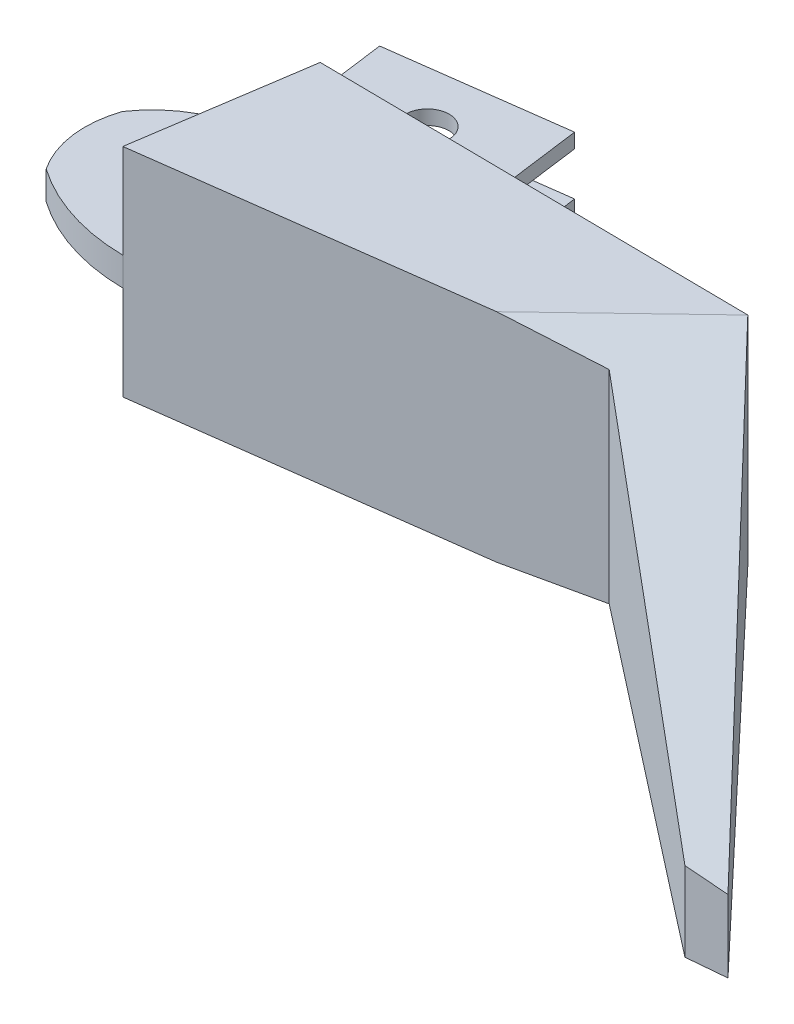
ISO-10303-21;
HEADER;
FILE_DESCRIPTION(('STEP AP214'),'2;1');
FILE_NAME('part.step','',(''),(''),'','','');
FILE_SCHEMA(('AUTOMOTIVE_DESIGN { 1 0 10303 214 1 1 1 1 }'));
ENDSEC;
DATA;
#1=APPLICATION_CONTEXT('core data for automotive mechanical design processes');
#2=APPLICATION_PROTOCOL_DEFINITION('international standard','automotive_design',2000,#1);
#3=PRODUCT_CONTEXT('',#1,'mechanical');
#4=PRODUCT('Part','Part','',(#3));
#5=PRODUCT_RELATED_PRODUCT_CATEGORY('part','',(#4));
#6=PRODUCT_DEFINITION_FORMATION('','',#4);
#7=PRODUCT_DEFINITION_CONTEXT('part definition',#1,'design');
#8=PRODUCT_DEFINITION('design','',#6,#7);
#9=PRODUCT_DEFINITION_SHAPE('','',#8);
#10=(LENGTH_UNIT() NAMED_UNIT(*) SI_UNIT(.MILLI.,.METRE.));
#11=(NAMED_UNIT(*) PLANE_ANGLE_UNIT() SI_UNIT($,.RADIAN.));
#12=(NAMED_UNIT(*) SI_UNIT($,.STERADIAN.) SOLID_ANGLE_UNIT());
#13=UNCERTAINTY_MEASURE_WITH_UNIT(LENGTH_MEASURE(1.E-05),#10,'distance_accuracy_value','');
#14=(GEOMETRIC_REPRESENTATION_CONTEXT(3) GLOBAL_UNCERTAINTY_ASSIGNED_CONTEXT((#13)) GLOBAL_UNIT_ASSIGNED_CONTEXT((#10,
#11,#12)) REPRESENTATION_CONTEXT('',''));
#15=CARTESIAN_POINT('',(0.,0.,0.));
#16=DIRECTION('',(0.,0.,1.));
#17=DIRECTION('',(1.,0.,0.));
#18=AXIS2_PLACEMENT_3D('',#15,#16,#17);
#19=CARTESIAN_POINT('',(-208.730671594199,65.2122922100915,-31.5270285220404));
#20=DIRECTION('',(0.,1.,0.));
#21=DIRECTION('',(0.,0.,1.));
#22=AXIS2_PLACEMENT_3D('',#19,#20,#21);
#23=PLANE('',#22);
#24=CARTESIAN_POINT('',(-255.193452215889,65.2122922100915,-58.7006078847417));
#25=DIRECTION('',(0.,1.,0.));
#26=DIRECTION('',(0.,0.,1.));
#27=AXIS2_PLACEMENT_3D('',#24,#25,#26);
#28=CIRCLE('',#27,9.99999999999998);
#29=CARTESIAN_POINT('',(-255.193452215889,65.2122922100915,-48.7006078847418));
#30=VERTEX_POINT('',#29);
#31=EDGE_CURVE('E310',#30,#30,#28,.T.);
#32=ORIENTED_EDGE('',*,*,#31,.T.);
#33=EDGE_LOOP('',(#32));
#34=FACE_BOUND('',#33,.T.);
#35=CARTESIAN_POINT('',(-211.981493351837,65.2122922100915,-138.427146033556));
#36=DIRECTION('',(0.,1.,0.));
#37=DIRECTION('',(0.,0.,-1.));
#38=AXIS2_PLACEMENT_3D('',#35,#36,#37);
#39=CIRCLE('',#38,138.975015680273);
#40=CARTESIAN_POINT('',(-291.658675420011,65.2122922100915,-24.5605502250968));
#41=VERTEX_POINT('',#40);
#42=CARTESIAN_POINT('',(-213.573939593585,65.2122922100915,0.538745818722125));
#43=VERTEX_POINT('',#42);
#44=EDGE_CURVE('E198',#41,#43,#39,.T.);
#45=ORIENTED_EDGE('',*,*,#44,.F.);
#46=CARTESIAN_POINT('',(-234.093409006673,65.2122922100915,-63.1153833177926));
#47=DIRECTION('',(0.,1.,0.));
#48=DIRECTION('',(0.,0.,-1.));
#49=AXIS2_PLACEMENT_3D('',#46,#47,#48);
#50=CIRCLE('',#49,69.2837286240006);
#51=CARTESIAN_POINT('',(-299.707915754918,65.2122922100915,-85.3633395436735));
#52=VERTEX_POINT('',#51);
#53=EDGE_CURVE('E186',#52,#41,#50,.T.);
#54=ORIENTED_EDGE('',*,*,#53,.F.);
#55=CARTESIAN_POINT('',(-235.950415718517,65.2122922100915,-42.2875097464173));
#56=DIRECTION('',(0.,-1.,0.));
#57=DIRECTION('',(0.,0.,-1.));
#58=AXIS2_PLACEMENT_3D('',#55,#56,#57);
#59=CIRCLE('',#58,76.9450838170563);
#60=CARTESIAN_POINT('',(-245.824298176033,65.2122922100915,-118.596436936026));
#61=VERTEX_POINT('',#60);
#62=EDGE_CURVE('E210',#61,#52,#59,.F.);
#63=ORIENTED_EDGE('',*,*,#62,.F.);
#64=DIRECTION('',(-0.999933359765905,0.,-0.0115445236917911));
#65=VECTOR('',#64,1.);
#66=CARTESIAN_POINT('',(-296.625222024867,65.2122922100915,-119.182948490231));
#67=LINE('',#66,#65);
#68=CARTESIAN_POINT('',(-224.317382142443,65.2122922100915,-118.348133287326));
#69=VERTEX_POINT('',#68);
#70=EDGE_CURVE('E355',#69,#61,#67,.T.);
#71=ORIENTED_EDGE('',*,*,#70,.F.);
#72=DIRECTION('',(0.131637339727023,0.,0.991297942492363));
#73=VECTOR('',#72,1.);
#74=CARTESIAN_POINT('',(-212.71784523073,65.2122922100915,-30.9975601270763));
#75=LINE('',#74,#73);
#76=CARTESIAN_POINT('',(-210.88984840221,65.2122922100915,-17.2317889655518));
#77=VERTEX_POINT('',#76);
#78=EDGE_CURVE('E275',#69,#77,#75,.T.);
#79=ORIENTED_EDGE('',*,*,#78,.T.);
#80=DIRECTION('',(0.149347695396157,0.,-0.988784741933176));
#81=VECTOR('',#80,1.);
#82=CARTESIAN_POINT('',(-208.730671594199,65.2122922100915,-31.5270285220404));
#83=LINE('',#82,#81);
#84=EDGE_CURVE('E205',#43,#77,#83,.T.);
#85=ORIENTED_EDGE('',*,*,#84,.F.);
#86=EDGE_LOOP('',(#45,#54,#63,#71,#79,#85));
#87=FACE_BOUND('',#86,.T.);
#88=ADVANCED_FACE('F39',(#34,#87),#23,.F.);
#89=CARTESIAN_POINT('',(-208.730671594199,84.9222773676956,-31.5270285220404));
#90=DIRECTION('',(0.,1.,0.));
#91=DIRECTION('',(0.,0.,1.));
#92=AXIS2_PLACEMENT_3D('',#89,#90,#91);
#93=PLANE('',#92);
#94=CARTESIAN_POINT('',(-234.093409006673,84.9222773676956,-63.1153833177926));
#95=DIRECTION('',(0.,1.,0.));
#96=DIRECTION('',(0.,0.,1.));
#97=AXIS2_PLACEMENT_3D('',#94,#95,#96);
#98=CIRCLE('',#97,69.2837286240006);
#99=CARTESIAN_POINT('',(-291.658675420011,84.9222773676956,-24.5605502250968));
#100=VERTEX_POINT('',#99);
#101=CARTESIAN_POINT('',(-299.707915754918,84.9222773676956,-85.3633395436735));
#102=VERTEX_POINT('',#101);
#103=EDGE_CURVE('E54',#100,#102,#98,.F.);
#104=ORIENTED_EDGE('',*,*,#103,.F.);
#105=CARTESIAN_POINT('',(-211.981493351837,84.9222773676956,-138.427146033556));
#106=DIRECTION('',(0.,1.,0.));
#107=DIRECTION('',(0.,0.,1.));
#108=AXIS2_PLACEMENT_3D('',#105,#106,#107);
#109=CIRCLE('',#108,138.975015680273);
#110=CARTESIAN_POINT('',(-213.573939593585,84.9222773676956,0.538745818722132));
#111=VERTEX_POINT('',#110);
#112=EDGE_CURVE('E201',#111,#100,#109,.F.);
#113=ORIENTED_EDGE('',*,*,#112,.F.);
#114=DIRECTION('',(0.149347695396157,0.,-0.988784741933176));
#115=VECTOR('',#114,1.);
#116=CARTESIAN_POINT('',(-208.730671594199,84.9222773676956,-31.5270285220404));
#117=LINE('',#116,#115);
#118=CARTESIAN_POINT('',(-210.88984840221,84.9222773676956,-17.2317889655518));
#119=VERTEX_POINT('',#118);
#120=EDGE_CURVE('E313',#111,#119,#117,.T.);
#121=ORIENTED_EDGE('',*,*,#120,.T.);
#122=DIRECTION('',(0.131637339727023,0.,0.991297942492363));
#123=VECTOR('',#122,1.);
#124=CARTESIAN_POINT('',(-212.71784523073,84.9222773676956,-30.9975601270763));
#125=LINE('',#124,#123);
#126=CARTESIAN_POINT('',(-224.317382142443,84.9222773676956,-118.348133287325));
#127=VERTEX_POINT('',#126);
#128=EDGE_CURVE('E270',#127,#119,#125,.T.);
#129=ORIENTED_EDGE('',*,*,#128,.F.);
#130=DIRECTION('',(-0.999933359765905,0.,-0.0115445236917911));
#131=VECTOR('',#130,1.);
#132=CARTESIAN_POINT('',(-296.625222024867,84.9222773676956,-119.182948490231));
#133=LINE('',#132,#131);
#134=CARTESIAN_POINT('',(-245.824298176033,84.9222773676956,-118.596436936026));
#135=VERTEX_POINT('',#134);
#136=EDGE_CURVE('E358',#127,#135,#133,.T.);
#137=ORIENTED_EDGE('',*,*,#136,.T.);
#138=CARTESIAN_POINT('',(-235.950415718517,84.9222773676956,-42.2875097464173));
#139=DIRECTION('',(0.,1.,0.));
#140=DIRECTION('',(0.,0.,1.));
#141=AXIS2_PLACEMENT_3D('',#138,#139,#140);
#142=CIRCLE('',#141,76.9450838170563);
#143=EDGE_CURVE('E47',#102,#135,#142,.F.);
#144=ORIENTED_EDGE('',*,*,#143,.F.);
#145=EDGE_LOOP('',(#104,#113,#121,#129,#137,#144));
#146=FACE_BOUND('',#145,.T.);
#147=CARTESIAN_POINT('',(-255.193452215889,84.9222773676956,-58.7006078847417));
#148=DIRECTION('',(0.,1.,0.));
#149=DIRECTION('',(0.,0.,1.));
#150=AXIS2_PLACEMENT_3D('',#147,#148,#149);
#151=CIRCLE('',#150,9.99999999999998);
#152=CARTESIAN_POINT('',(-255.193452215889,84.9222773676956,-48.7006078847418));
#153=VERTEX_POINT('',#152);
#154=EDGE_CURVE('E307',#153,#153,#151,.T.);
#155=ORIENTED_EDGE('',*,*,#154,.F.);
#156=EDGE_LOOP('',(#155));
#157=FACE_BOUND('',#156,.T.);
#158=ADVANCED_FACE('F391',(#146,#157),#93,.T.);
#159=CARTESIAN_POINT('',(-29.9580583713106,0.,-225.599831219089));
#160=DIRECTION('',(0.131637339727023,0.,0.991297942492363));
#161=DIRECTION('',(0.991297942492363,0.,-0.131637339727023));
#162=AXIS2_PLACEMENT_3D('',#159,#160,#161);
#163=PLANE('',#162);
#164=DIRECTION('',(0.,-1.,0.));
#165=VECTOR('',#164,1.);
#166=CARTESIAN_POINT('',(-234.944917826527,100.,-198.379029378386));
#167=LINE('',#166,#165);
#168=CARTESIAN_POINT('',(-234.944917826527,60.,-198.379029378386));
#169=VERTEX_POINT('',#168);
#170=CARTESIAN_POINT('',(-234.944917826527,50.,-198.379029378386));
#171=VERTEX_POINT('',#170);
#172=EDGE_CURVE('E248',#169,#171,#167,.T.);
#173=ORIENTED_EDGE('',*,*,#172,.F.);
#174=DIRECTION('',(0.991297942492363,0.,-0.131637339727023));
#175=VECTOR('',#174,1.);
#176=CARTESIAN_POINT('',(-29.9580583713106,60.,-225.599831219089));
#177=LINE('',#176,#175);
#178=CARTESIAN_POINT('',(-115.989164727444,60.,-214.175510145628));
#179=VERTEX_POINT('',#178);
#180=EDGE_CURVE('E374',#169,#179,#177,.T.);
#181=ORIENTED_EDGE('',*,*,#180,.T.);
#182=DIRECTION('',(0.,1.,0.));
#183=VECTOR('',#182,1.);
#184=CARTESIAN_POINT('',(-115.989164727444,100.,-214.175510145628));
#185=LINE('',#184,#183);
#186=CARTESIAN_POINT('',(-115.989164727444,50.,-214.175510145628));
#187=VERTEX_POINT('',#186);
#188=EDGE_CURVE('E242',#187,#179,#185,.T.);
#189=ORIENTED_EDGE('',*,*,#188,.F.);
#190=DIRECTION('',(0.991297942492363,0.,-0.131637339727023));
#191=VECTOR('',#190,1.);
#192=CARTESIAN_POINT('',(-234.944917826527,50.,-198.379029378386));
#193=LINE('',#192,#191);
#194=EDGE_CURVE('E252',#171,#187,#193,.T.);
#195=ORIENTED_EDGE('',*,*,#194,.F.);
#196=EDGE_LOOP('',(#173,#181,#189,#195));
#197=FACE_BOUND('',#196,.T.);
#198=ADVANCED_FACE('F410',(#197),#163,.F.);
#199=CARTESIAN_POINT('',(-296.625222024867,150.,-119.182948490231));
#200=DIRECTION('',(-0.0115445236917911,0.,0.999933359765904));
#201=DIRECTION('',(0.999933359765905,0.,0.0115445236917911));
#202=AXIS2_PLACEMENT_3D('',#199,#200,#201);
#203=PLANE('',#202);
#204=ORIENTED_EDGE('',*,*,#70,.T.);
#205=DIRECTION('',(0.,-1.,0.));
#206=VECTOR('',#205,1.);
#207=CARTESIAN_POINT('',(-245.824298176033,665.212292210092,-118.596436936026));
#208=LINE('',#207,#206);
#209=EDGE_CURVE('E207',#135,#61,#208,.T.);
#210=ORIENTED_EDGE('',*,*,#209,.F.);
#211=ORIENTED_EDGE('',*,*,#136,.F.);
#212=DIRECTION('',(0.,-1.,0.));
#213=VECTOR('',#212,1.);
#214=CARTESIAN_POINT('',(-224.317382142443,150.,-118.348133287326));
#215=LINE('',#214,#213);
#216=EDGE_CURVE('E273',#127,#69,#215,.T.);
#217=ORIENTED_EDGE('',*,*,#216,.T.);
#218=EDGE_LOOP('',(#204,#210,#211,#217));
#219=FACE_BOUND('',#218,.T.);
#220=ADVANCED_FACE('F388',(#219),#203,.F.);
#221=CARTESIAN_POINT('',(83.2218191581831,150.,-38.8736270407595));
#222=DIRECTION('',(-0.131637339727023,0.,-0.991297942492363));
#223=DIRECTION('',(-0.991297942492363,0.,0.131637339727023));
#224=AXIS2_PLACEMENT_3D('',#221,#222,#223);
#225=PLANE('',#224);
#226=DIRECTION('',(0.,1.,0.));
#227=VECTOR('',#226,1.);
#228=CARTESIAN_POINT('',(-213.573939593585,150.,0.538745818722132));
#229=LINE('',#228,#227);
#230=CARTESIAN_POINT('',(-213.573939593585,150.,0.538745818722125));
#231=VERTEX_POINT('',#230);
#232=EDGE_CURVE('E324',#111,#231,#229,.T.);
#233=ORIENTED_EDGE('',*,*,#232,.F.);
#234=DIRECTION('',(0.,-1.,0.));
#235=VECTOR('',#234,1.);
#236=CARTESIAN_POINT('',(-213.573939593585,665.212292210092,0.538745818722125));
#237=LINE('',#236,#235);
#238=EDGE_CURVE('E206',#111,#43,#237,.T.);
#239=ORIENTED_EDGE('',*,*,#238,.T.);
#240=DIRECTION('',(0.,1.,0.));
#241=VECTOR('',#240,1.);
#242=CARTESIAN_POINT('',(-213.573939593585,150.,0.538745818722132));
#243=LINE('',#242,#241);
#244=CARTESIAN_POINT('',(-213.573939593585,0.,0.538745818722125));
#245=VERTEX_POINT('',#244);
#246=EDGE_CURVE('E319',#245,#43,#243,.T.);
#247=ORIENTED_EDGE('',*,*,#246,.F.);
#248=DIRECTION('',(0.991297942492363,0.,-0.131637339727023));
#249=VECTOR('',#248,1.);
#250=CARTESIAN_POINT('',(83.2218191581831,0.,-38.8736270407595));
#251=LINE('',#250,#249);
#252=CARTESIAN_POINT('',(14.5560714943781,0.,-29.755302503432));
#253=VERTEX_POINT('',#252);
#254=EDGE_CURVE('E326',#245,#253,#251,.T.);
#255=ORIENTED_EDGE('',*,*,#254,.T.);
#256=DIRECTION('',(0.988866821875745,0.0699922109604098,-0.131314504142675));
#257=VECTOR('',#256,1.);
#258=CARTESIAN_POINT('',(93.2673781493679,5.5712035822128,-40.2076060646094));
#259=LINE('',#258,#257);
#260=CARTESIAN_POINT('',(83.2218191581831,4.86017670925883,-38.8736270407595));
#261=VERTEX_POINT('',#260);
#262=EDGE_CURVE('E298',#253,#261,#259,.T.);
#263=ORIENTED_EDGE('',*,*,#262,.T.);
#264=DIRECTION('',(0.,-1.,0.));
#265=VECTOR('',#264,1.);
#266=CARTESIAN_POINT('',(83.2218191581831,150.,-38.8736270407595));
#267=LINE('',#266,#265);
#268=CARTESIAN_POINT('',(83.2218191581831,145.139823290741,-38.8736270407595));
#269=VERTEX_POINT('',#268);
#270=EDGE_CURVE('E347',#269,#261,#267,.T.);
#271=ORIENTED_EDGE('',*,*,#270,.F.);
#272=DIRECTION('',(0.988866821875745,-0.0699922109604098,-0.131314504142675));
#273=VECTOR('',#272,1.);
#274=CARTESIAN_POINT('',(82.8854318680963,145.163632857056,-38.8289571931921));
#275=LINE('',#274,#273);
#276=CARTESIAN_POINT('',(14.5560714943781,150.,-29.755302503432));
#277=VERTEX_POINT('',#276);
#278=EDGE_CURVE('E305',#277,#269,#275,.T.);
#279=ORIENTED_EDGE('',*,*,#278,.F.);
#280=DIRECTION('',(0.991297942492363,0.,-0.131637339727023));
#281=VECTOR('',#280,1.);
#282=CARTESIAN_POINT('',(83.2218191581831,150.,-38.8736270407595));
#283=LINE('',#282,#281);
#284=EDGE_CURVE('E327',#231,#277,#283,.T.);
#285=ORIENTED_EDGE('',*,*,#284,.F.);
#286=EDGE_LOOP('',(#233,#239,#247,#255,#263,#271,#279,#285));
#287=FACE_BOUND('',#286,.T.);
#288=ADVANCED_FACE('F41',(#287),#225,.F.);
#289=CARTESIAN_POINT('',(0.,150.,0.));
#290=DIRECTION('',(0.,1.,0.));
#291=DIRECTION('',(0.,0.,1.));
#292=AXIS2_PLACEMENT_3D('',#289,#290,#291);
#293=PLANE('',#292);
#294=ORIENTED_EDGE('',*,*,#284,.T.);
#295=DIRECTION('',(0.723241509717924,0.,-0.690595191570965));
#296=VECTOR('',#295,1.);
#297=CARTESIAN_POINT('',(-268.116954932111,150.,240.158177591317));
#298=LINE('',#297,#296);
#299=CARTESIAN_POINT('',(103.374777975133,150.,-114.564831261101));
#300=VERTEX_POINT('',#299);
#301=EDGE_CURVE('E286',#277,#300,#298,.T.);
#302=ORIENTED_EDGE('',*,*,#301,.T.);
#303=DIRECTION('',(-0.999933359765904,0.,-0.0115445236917911));
#304=VECTOR('',#303,1.);
#305=CARTESIAN_POINT('',(-296.625222024867,150.,-119.182948490231));
#306=LINE('',#305,#304);
#307=CARTESIAN_POINT('',(-195.667028297471,150.,-118.017356555545));
#308=VERTEX_POINT('',#307);
#309=EDGE_CURVE('E330',#300,#308,#306,.T.);
#310=ORIENTED_EDGE('',*,*,#309,.T.);
#311=DIRECTION('',(-0.149347695396157,0.,0.988784741933176));
#312=VECTOR('',#311,1.);
#313=CARTESIAN_POINT('',(-208.730671594199,150.,-31.5270285220404));
#314=LINE('',#313,#312);
#315=EDGE_CURVE('E352',#308,#231,#314,.T.);
#316=ORIENTED_EDGE('',*,*,#315,.T.);
#317=EDGE_LOOP('',(#294,#302,#310,#316));
#318=FACE_BOUND('',#317,.T.);
#319=ADVANCED_FACE('F467',(#318),#293,.T.);
#320=CARTESIAN_POINT('',(363.661240814357,150.,189.196602820427));
#321=DIRECTION('',(0.63094783235923,0.,-0.77582525921833));
#322=DIRECTION('',(-0.77582525921833,0.,-0.63094783235923));
#323=AXIS2_PLACEMENT_3D('',#320,#321,#322);
#324=PLANE('',#323);
#325=DIRECTION('',(0.770470016775908,-0.117292938821412,0.626592626633899));
#326=VECTOR('',#325,1.);
#327=CARTESIAN_POINT('',(359.363840497909,103.101186471935,185.701698030688));
#328=LINE('',#327,#326);
#329=CARTESIAN_POINT('',(363.661240814357,102.44696930393,189.196602820427));
#330=VERTEX_POINT('',#329);
#331=EDGE_CURVE('E303',#269,#330,#328,.T.);
#332=ORIENTED_EDGE('',*,*,#331,.F.);
#333=ORIENTED_EDGE('',*,*,#270,.T.);
#334=DIRECTION('',(0.770470016775908,0.117292938821412,0.626592626633899));
#335=VECTOR('',#334,1.);
#336=CARTESIAN_POINT('',(372.919444379124,48.9624585526692,196.725931623946));
#337=LINE('',#336,#335);
#338=CARTESIAN_POINT('',(363.661240814357,47.5530306960701,189.196602820427));
#339=VERTEX_POINT('',#338);
#340=EDGE_CURVE('E295',#261,#339,#337,.T.);
#341=ORIENTED_EDGE('',*,*,#340,.T.);
#342=DIRECTION('',(0.,-1.,0.));
#343=VECTOR('',#342,1.);
#344=CARTESIAN_POINT('',(363.661240814357,150.,189.196602820427));
#345=LINE('',#344,#343);
#346=EDGE_CURVE('E344',#330,#339,#345,.T.);
#347=ORIENTED_EDGE('',*,*,#346,.F.);
#348=EDGE_LOOP('',(#332,#333,#341,#347));
#349=FACE_BOUND('',#348,.T.);
#350=ADVANCED_FACE('F470',(#349),#324,.F.);
#351=CARTESIAN_POINT('',(393.424758434938,150.,189.196602820427));
#352=DIRECTION('',(0.,0.,-1.));
#353=DIRECTION('',(-1.,0.,0.));
#354=AXIS2_PLACEMENT_3D('',#351,#352,#353);
#355=PLANE('',#354);
#356=DIRECTION('',(0.996637488754219,-0.0819372687467888,0.));
#357=VECTOR('',#356,1.);
#358=CARTESIAN_POINT('',(389.34167074698,100.335685800484,189.196602820427));
#359=LINE('',#358,#357);
#360=CARTESIAN_POINT('',(393.424758434938,100.,189.196602820427));
#361=VERTEX_POINT('',#360);
#362=EDGE_CURVE('E301',#330,#361,#359,.T.);
#363=ORIENTED_EDGE('',*,*,#362,.F.);
#364=ORIENTED_EDGE('',*,*,#346,.T.);
#365=DIRECTION('',(0.996637488754219,0.0819372687467888,0.));
#366=VECTOR('',#365,1.);
#367=CARTESIAN_POINT('',(401.590933810856,50.6713716009683,189.196602820427));
#368=LINE('',#367,#366);
#369=CARTESIAN_POINT('',(393.424758434938,50.,189.196602820427));
#370=VERTEX_POINT('',#369);
#371=EDGE_CURVE('E290',#339,#370,#368,.T.);
#372=ORIENTED_EDGE('',*,*,#371,.T.);
#373=DIRECTION('',(0.,-1.,0.));
#374=VECTOR('',#373,1.);
#375=CARTESIAN_POINT('',(393.424758434938,150.,189.196602820427));
#376=LINE('',#375,#374);
#377=EDGE_CURVE('E341',#361,#370,#376,.T.);
#378=ORIENTED_EDGE('',*,*,#377,.F.);
#379=EDGE_LOOP('',(#363,#364,#372,#378));
#380=FACE_BOUND('',#379,.T.);
#381=ADVANCED_FACE('F479',(#380),#355,.F.);
#382=CARTESIAN_POINT('',(103.374777975133,150.,-114.564831261101));
#383=DIRECTION('',(-0.723241509717924,0.,0.690595191570965));
#384=DIRECTION('',(0.690595191570965,0.,0.723241509717924));
#385=AXIS2_PLACEMENT_3D('',#382,#383,#384);
#386=PLANE('',#385);
#387=DIRECTION('',(0.685752927445379,-0.118212889785112,0.718170338560947));
#388=VECTOR('',#387,1.);
#389=CARTESIAN_POINT('',(103.374777975133,150.,-114.564831261101));
#390=LINE('',#389,#388);
#391=EDGE_CURVE('E283',#300,#361,#390,.T.);
#392=ORIENTED_EDGE('',*,*,#391,.T.);
#393=ORIENTED_EDGE('',*,*,#377,.T.);
#394=DIRECTION('',(0.685752927445379,0.118212889785112,0.718170338560947));
#395=VECTOR('',#394,1.);
#396=CARTESIAN_POINT('',(103.374777975133,0.,-114.564831261101));
#397=LINE('',#396,#395);
#398=CARTESIAN_POINT('',(103.374777975133,0.,-114.564831261101));
#399=VERTEX_POINT('',#398);
#400=EDGE_CURVE('E287',#399,#370,#397,.T.);
#401=ORIENTED_EDGE('',*,*,#400,.F.);
#402=DIRECTION('',(0.,-1.,0.));
#403=VECTOR('',#402,1.);
#404=CARTESIAN_POINT('',(103.374777975133,150.,-114.564831261101));
#405=LINE('',#404,#403);
#406=EDGE_CURVE('E334',#300,#399,#405,.T.);
#407=ORIENTED_EDGE('',*,*,#406,.F.);
#408=EDGE_LOOP('',(#392,#393,#401,#407));
#409=FACE_BOUND('',#408,.T.);
#410=ADVANCED_FACE('F476',(#409),#386,.F.);
#411=DIRECTION('',(0.,-1.,0.));
#412=VECTOR('',#411,1.);
#413=CARTESIAN_POINT('',(-195.667028297471,150.,-118.017356555545));
#414=LINE('',#413,#412);
#415=CARTESIAN_POINT('',(-195.667028297471,50.,-118.017356555545));
#416=VERTEX_POINT('',#415);
#417=CARTESIAN_POINT('',(-195.667028297471,0.,-118.017356555545));
#418=VERTEX_POINT('',#417);
#419=EDGE_CURVE('E316',#416,#418,#414,.T.);
#420=ORIENTED_EDGE('',*,*,#419,.F.);
#421=DIRECTION('',(0.999933359765904,0.,0.0115445236917911));
#422=VECTOR('',#421,1.);
#423=CARTESIAN_POINT('',(-296.625222024867,50.,-119.182948490231));
#424=LINE('',#423,#422);
#425=CARTESIAN_POINT('',(-103.078092408809,50.,-116.94839015541));
#426=VERTEX_POINT('',#425);
#427=EDGE_CURVE('E280',#416,#426,#424,.T.);
#428=ORIENTED_EDGE('',*,*,#427,.T.);
#429=DIRECTION('',(0.,1.,0.));
#430=VECTOR('',#429,1.);
#431=CARTESIAN_POINT('',(-103.078092408809,150.,-116.94839015541));
#432=LINE('',#431,#430);
#433=CARTESIAN_POINT('',(-103.078092408809,100.,-116.94839015541));
#434=VERTEX_POINT('',#433);
#435=EDGE_CURVE('E370',#426,#434,#432,.T.);
#436=ORIENTED_EDGE('',*,*,#435,.T.);
#437=DIRECTION('',(-0.999933359765904,0.,-0.0115445236917911));
#438=VECTOR('',#437,1.);
#439=CARTESIAN_POINT('',(-296.625222024867,100.,-119.182948490231));
#440=LINE('',#439,#438);
#441=CARTESIAN_POINT('',(-195.667028297471,100.,-118.017356555545));
#442=VERTEX_POINT('',#441);
#443=EDGE_CURVE('E259',#434,#442,#440,.T.);
#444=ORIENTED_EDGE('',*,*,#443,.T.);
#445=DIRECTION('',(0.,-1.,0.));
#446=VECTOR('',#445,1.);
#447=CARTESIAN_POINT('',(-195.667028297471,150.,-118.017356555545));
#448=LINE('',#447,#446);
#449=EDGE_CURVE('E322',#308,#442,#448,.T.);
#450=ORIENTED_EDGE('',*,*,#449,.F.);
#451=ORIENTED_EDGE('',*,*,#309,.F.);
#452=ORIENTED_EDGE('',*,*,#406,.T.);
#453=DIRECTION('',(-0.999933359765904,0.,-0.0115445236917911));
#454=VECTOR('',#453,1.);
#455=CARTESIAN_POINT('',(-296.625222024867,0.,-119.182948490231));
#456=LINE('',#455,#454);
#457=EDGE_CURVE('E331',#399,#418,#456,.T.);
#458=ORIENTED_EDGE('',*,*,#457,.T.);
#459=EDGE_LOOP('',(#420,#428,#436,#444,#450,#451,#452,#458));
#460=FACE_BOUND('',#459,.T.);
#461=ADVANCED_FACE('F417',(#460),#203,.F.);
#462=CARTESIAN_POINT('',(0.,0.,0.));
#463=DIRECTION('',(0.,1.,0.));
#464=DIRECTION('',(0.,0.,1.));
#465=AXIS2_PLACEMENT_3D('',#462,#463,#464);
#466=PLANE('',#465);
#467=ORIENTED_EDGE('',*,*,#457,.F.);
#468=DIRECTION('',(0.723241509717924,0.,-0.690595191570965));
#469=VECTOR('',#468,1.);
#470=CARTESIAN_POINT('',(-268.116954932111,0.,240.158177591317));
#471=LINE('',#470,#469);
#472=EDGE_CURVE('E282',#253,#399,#471,.T.);
#473=ORIENTED_EDGE('',*,*,#472,.F.);
#474=ORIENTED_EDGE('',*,*,#254,.F.);
#475=DIRECTION('',(-0.149347695396157,0.,0.988784741933176));
#476=VECTOR('',#475,1.);
#477=CARTESIAN_POINT('',(-208.730671594199,0.,-31.5270285220404));
#478=LINE('',#477,#476);
#479=EDGE_CURVE('E350',#418,#245,#478,.T.);
#480=ORIENTED_EDGE('',*,*,#479,.F.);
#481=EDGE_LOOP('',(#467,#473,#474,#480));
#482=FACE_BOUND('',#481,.T.);
#483=ADVANCED_FACE('F423',(#482),#466,.F.);
#484=CARTESIAN_POINT('',(-208.730671594199,0.,-31.5270285220404));
#485=DIRECTION('',(-0.988784741933176,0.,-0.149347695396157));
#486=DIRECTION('',(-0.149347695396157,0.,0.988784741933176));
#487=AXIS2_PLACEMENT_3D('',#484,#485,#486);
#488=PLANE('',#487);
#489=DIRECTION('',(-0.149347695396157,0.,0.988784741933176));
#490=VECTOR('',#489,1.);
#491=CARTESIAN_POINT('',(-208.730671594199,50.,-31.5270285220404));
#492=LINE('',#491,#490);
#493=CARTESIAN_POINT('',(-210.88984840221,50.,-17.2317889655518));
#494=VERTEX_POINT('',#493);
#495=EDGE_CURVE('E367',#416,#494,#492,.T.);
#496=ORIENTED_EDGE('',*,*,#495,.F.);
#497=ORIENTED_EDGE('',*,*,#419,.T.);
#498=ORIENTED_EDGE('',*,*,#479,.T.);
#499=ORIENTED_EDGE('',*,*,#246,.T.);
#500=ORIENTED_EDGE('',*,*,#84,.T.);
#501=DIRECTION('',(0.,1.,0.));
#502=VECTOR('',#501,1.);
#503=CARTESIAN_POINT('',(-210.88984840221,0.,-17.2317889655518));
#504=LINE('',#503,#502);
#505=EDGE_CURVE('E277',#494,#77,#504,.T.);
#506=ORIENTED_EDGE('',*,*,#505,.F.);
#507=EDGE_LOOP('',(#496,#497,#498,#499,#500,#506));
#508=FACE_BOUND('',#507,.T.);
#509=ADVANCED_FACE('F400',(#508),#488,.T.);
#510=CARTESIAN_POINT('',(-208.730671594199,0.,-31.5270285220404));
#511=DIRECTION('',(-0.988784741933176,0.,-0.149347695396157));
#512=DIRECTION('',(-0.149347695396157,0.,0.988784741933176));
#513=AXIS2_PLACEMENT_3D('',#510,#511,#512);
#514=PLANE('',#513);
#515=DIRECTION('',(0.,1.,0.));
#516=VECTOR('',#515,1.);
#517=CARTESIAN_POINT('',(-210.88984840221,0.,-17.2317889655518));
#518=LINE('',#517,#516);
#519=CARTESIAN_POINT('',(-210.88984840221,100.,-17.2317889655526));
#520=VERTEX_POINT('',#519);
#521=EDGE_CURVE('E364',#119,#520,#518,.T.);
#522=ORIENTED_EDGE('',*,*,#521,.F.);
#523=ORIENTED_EDGE('',*,*,#120,.F.);
#524=ORIENTED_EDGE('',*,*,#232,.T.);
#525=ORIENTED_EDGE('',*,*,#315,.F.);
#526=ORIENTED_EDGE('',*,*,#449,.T.);
#527=DIRECTION('',(0.149347695396157,0.,-0.988784741933176));
#528=VECTOR('',#527,1.);
#529=CARTESIAN_POINT('',(-208.730671594199,100.,-31.5270285220404));
#530=LINE('',#529,#528);
#531=EDGE_CURVE('E361',#520,#442,#530,.T.);
#532=ORIENTED_EDGE('',*,*,#531,.F.);
#533=EDGE_LOOP('',(#522,#523,#524,#525,#526,#532));
#534=FACE_BOUND('',#533,.T.);
#535=ADVANCED_FACE('F430',(#534),#514,.T.);
#536=CARTESIAN_POINT('',(-255.193452215889,-15.0777226323044,-58.7006078847417));
#537=DIRECTION('',(0.,1.,0.));
#538=DIRECTION('',(0.,0.,1.));
#539=AXIS2_PLACEMENT_3D('',#536,#537,#538);
#540=CYLINDRICAL_SURFACE('',#539,9.99999999999998);
#541=ORIENTED_EDGE('',*,*,#154,.T.);
#542=EDGE_LOOP('',(#541));
#543=FACE_BOUND('',#542,.T.);
#544=ORIENTED_EDGE('',*,*,#31,.F.);
#545=EDGE_LOOP('',(#544));
#546=FACE_BOUND('',#545,.T.);
#547=ADVANCED_FACE('F506',(#543,#546),#540,.F.);
#548=CARTESIAN_POINT('',(-268.116954932111,0.,240.158177591317));
#549=DIRECTION('',(-0.081637253267307,0.992988274194944,-0.0854964688763032));
#550=DIRECTION('',(0.,0.0857828025483128,0.996313861585272));
#551=AXIS2_PLACEMENT_3D('',#548,#549,#550);
#552=PLANE('',#551);
#553=ORIENTED_EDGE('',*,*,#472,.T.);
#554=ORIENTED_EDGE('',*,*,#400,.T.);
#555=ORIENTED_EDGE('',*,*,#371,.F.);
#556=ORIENTED_EDGE('',*,*,#340,.F.);
#557=ORIENTED_EDGE('',*,*,#262,.F.);
#558=EDGE_LOOP('',(#553,#554,#555,#556,#557));
#559=FACE_BOUND('',#558,.T.);
#560=ADVANCED_FACE('F497',(#559),#552,.F.);
#561=CARTESIAN_POINT('',(-268.116954932111,150.,240.158177591317));
#562=DIRECTION('',(0.081637253267307,0.992988274194944,0.0854964688763032));
#563=DIRECTION('',(0.,-0.0857828025483128,0.996313861585272));
#564=AXIS2_PLACEMENT_3D('',#561,#562,#563);
#565=PLANE('',#564);
#566=ORIENTED_EDGE('',*,*,#278,.T.);
#567=ORIENTED_EDGE('',*,*,#331,.T.);
#568=ORIENTED_EDGE('',*,*,#362,.T.);
#569=ORIENTED_EDGE('',*,*,#391,.F.);
#570=ORIENTED_EDGE('',*,*,#301,.F.);
#571=EDGE_LOOP('',(#566,#567,#568,#569,#570));
#572=FACE_BOUND('',#571,.T.);
#573=ADVANCED_FACE('F498',(#572),#565,.T.);
#574=CARTESIAN_POINT('',(-115.989164727444,100.,-214.175510145628));
#575=DIRECTION('',(0.991297942492363,0.,-0.131637339727023));
#576=DIRECTION('',(-0.131637339727023,0.,-0.991297942492363));
#577=AXIS2_PLACEMENT_3D('',#574,#575,#576);
#578=PLANE('',#577);
#579=DIRECTION('',(-0.131637339727023,0.,-0.991297942492363));
#580=VECTOR('',#579,1.);
#581=CARTESIAN_POINT('',(-115.989164727444,60.,-214.175510145628));
#582=LINE('',#581,#580);
#583=CARTESIAN_POINT('',(-108.090924343823,60.,-154.697633596087));
#584=VERTEX_POINT('',#583);
#585=EDGE_CURVE('E236',#584,#179,#582,.T.);
#586=ORIENTED_EDGE('',*,*,#585,.F.);
#587=DIRECTION('',(0.,1.,0.));
#588=VECTOR('',#587,1.);
#589=CARTESIAN_POINT('',(-108.090924343823,100.,-154.697633596087));
#590=LINE('',#589,#588);
#591=CARTESIAN_POINT('',(-108.090924343823,90.,-154.697633596087));
#592=VERTEX_POINT('',#591);
#593=EDGE_CURVE('E238',#584,#592,#590,.T.);
#594=ORIENTED_EDGE('',*,*,#593,.T.);
#595=DIRECTION('',(0.131637339727023,0.,0.991297942492363));
#596=VECTOR('',#595,1.);
#597=CARTESIAN_POINT('',(-115.989164727444,90.,-214.175510145628));
#598=LINE('',#597,#596);
#599=CARTESIAN_POINT('',(-115.989164727444,90.,-214.175510145628));
#600=VERTEX_POINT('',#599);
#601=EDGE_CURVE('E232',#600,#592,#598,.T.);
#602=ORIENTED_EDGE('',*,*,#601,.F.);
#603=CARTESIAN_POINT('',(-115.989164727444,100.,-214.175510145628));
#604=VERTEX_POINT('',#603);
#605=EDGE_CURVE('E241',#600,#604,#185,.T.);
#606=ORIENTED_EDGE('',*,*,#605,.T.);
#607=DIRECTION('',(0.131637339727023,0.,0.991297942492363));
#608=VECTOR('',#607,1.);
#609=CARTESIAN_POINT('',(-115.989164727444,100.,-214.175510145628));
#610=LINE('',#609,#608);
#611=EDGE_CURVE('E255',#604,#434,#610,.T.);
#612=ORIENTED_EDGE('',*,*,#611,.T.);
#613=ORIENTED_EDGE('',*,*,#435,.F.);
#614=DIRECTION('',(0.131637339727023,0.,0.991297942492363));
#615=VECTOR('',#614,1.);
#616=CARTESIAN_POINT('',(-115.989164727444,50.,-214.175510145628));
#617=LINE('',#616,#615);
#618=EDGE_CURVE('E256',#187,#426,#617,.T.);
#619=ORIENTED_EDGE('',*,*,#618,.F.);
#620=ORIENTED_EDGE('',*,*,#188,.T.);
#621=EDGE_LOOP('',(#586,#594,#602,#606,#612,#613,#619,#620));
#622=FACE_BOUND('',#621,.T.);
#623=ADVANCED_FACE('F413',(#622),#578,.T.);
#624=CARTESIAN_POINT('',(-234.944917826527,50.,-198.379029378386));
#625=DIRECTION('',(0.,-1.,0.));
#626=DIRECTION('',(0.,0.,-1.));
#627=AXIS2_PLACEMENT_3D('',#624,#625,#626);
#628=PLANE('',#627);
#629=CARTESIAN_POINT('',(-170.201547687905,50.,-166.625352062312));
#630=DIRECTION('',(0.,-1.,0.));
#631=DIRECTION('',(0.,0.,-1.));
#632=AXIS2_PLACEMENT_3D('',#629,#630,#631);
#633=CIRCLE('',#632,15.);
#634=CARTESIAN_POINT('',(-170.201547687905,50.,-181.625352062313));
#635=VERTEX_POINT('',#634);
#636=EDGE_CURVE('E215',#635,#635,#633,.T.);
#637=ORIENTED_EDGE('',*,*,#636,.F.);
#638=EDGE_LOOP('',(#637));
#639=FACE_BOUND('',#638,.T.);
#640=ORIENTED_EDGE('',*,*,#427,.F.);
#641=ORIENTED_EDGE('',*,*,#495,.T.);
#642=DIRECTION('',(0.131637339727023,0.,0.991297942492363));
#643=VECTOR('',#642,1.);
#644=CARTESIAN_POINT('',(-234.944917826527,50.,-198.379029378386));
#645=LINE('',#644,#643);
#646=EDGE_CURVE('E260',#171,#494,#645,.T.);
#647=ORIENTED_EDGE('',*,*,#646,.F.);
#648=ORIENTED_EDGE('',*,*,#194,.T.);
#649=ORIENTED_EDGE('',*,*,#618,.T.);
#650=EDGE_LOOP('',(#640,#641,#647,#648,#649));
#651=FACE_BOUND('',#650,.T.);
#652=ADVANCED_FACE('F407',(#639,#651),#628,.T.);
#653=CARTESIAN_POINT('',(-234.944917826527,100.,-198.379029378386));
#654=DIRECTION('',(0.,1.,0.));
#655=DIRECTION('',(0.,0.,1.));
#656=AXIS2_PLACEMENT_3D('',#653,#654,#655);
#657=PLANE('',#656);
#658=CARTESIAN_POINT('',(-170.201547687905,100.,-166.625352062312));
#659=DIRECTION('',(0.,1.,0.));
#660=DIRECTION('',(0.,0.,1.));
#661=AXIS2_PLACEMENT_3D('',#658,#659,#660);
#662=CIRCLE('',#661,15.);
#663=CARTESIAN_POINT('',(-170.201547687905,100.,-151.625352062312));
#664=VERTEX_POINT('',#663);
#665=EDGE_CURVE('E222',#664,#664,#662,.T.);
#666=ORIENTED_EDGE('',*,*,#665,.F.);
#667=EDGE_LOOP('',(#666));
#668=FACE_BOUND('',#667,.T.);
#669=ORIENTED_EDGE('',*,*,#443,.F.);
#670=ORIENTED_EDGE('',*,*,#611,.F.);
#671=DIRECTION('',(-0.991297942492363,0.,0.131637339727023));
#672=VECTOR('',#671,1.);
#673=CARTESIAN_POINT('',(-234.944917826527,100.,-198.379029378386));
#674=LINE('',#673,#672);
#675=CARTESIAN_POINT('',(-234.944917826527,100.,-198.379029378386));
#676=VERTEX_POINT('',#675);
#677=EDGE_CURVE('E245',#604,#676,#674,.T.);
#678=ORIENTED_EDGE('',*,*,#677,.T.);
#679=DIRECTION('',(0.131637339727023,0.,0.991297942492363));
#680=VECTOR('',#679,1.);
#681=CARTESIAN_POINT('',(-234.944917826527,100.,-198.379029378386));
#682=LINE('',#681,#680);
#683=EDGE_CURVE('E263',#676,#520,#682,.T.);
#684=ORIENTED_EDGE('',*,*,#683,.T.);
#685=ORIENTED_EDGE('',*,*,#531,.T.);
#686=EDGE_LOOP('',(#669,#670,#678,#684,#685));
#687=FACE_BOUND('',#686,.T.);
#688=ADVANCED_FACE('F433',(#668,#687),#657,.T.);
#689=CARTESIAN_POINT('',(-234.944917826527,100.,-198.379029378386));
#690=DIRECTION('',(-0.991297942492363,0.,0.131637339727023));
#691=DIRECTION('',(0.131637339727023,0.,0.991297942492363));
#692=AXIS2_PLACEMENT_3D('',#689,#690,#691);
#693=PLANE('',#692);
#694=DIRECTION('',(0.131637339727023,0.,0.991297942492363));
#695=VECTOR('',#694,1.);
#696=CARTESIAN_POINT('',(-234.944917826527,60.,-198.379029378386));
#697=LINE('',#696,#695);
#698=CARTESIAN_POINT('',(-227.046677442906,60.,-138.901152828844));
#699=VERTEX_POINT('',#698);
#700=EDGE_CURVE('E234',#169,#699,#697,.T.);
#701=ORIENTED_EDGE('',*,*,#700,.F.);
#702=ORIENTED_EDGE('',*,*,#172,.T.);
#703=ORIENTED_EDGE('',*,*,#646,.T.);
#704=ORIENTED_EDGE('',*,*,#505,.T.);
#705=ORIENTED_EDGE('',*,*,#78,.F.);
#706=ORIENTED_EDGE('',*,*,#216,.F.);
#707=ORIENTED_EDGE('',*,*,#128,.T.);
#708=ORIENTED_EDGE('',*,*,#521,.T.);
#709=ORIENTED_EDGE('',*,*,#683,.F.);
#710=CARTESIAN_POINT('',(-234.944917826527,90.,-198.379029378386));
#711=VERTEX_POINT('',#710);
#712=EDGE_CURVE('E249',#676,#711,#167,.T.);
#713=ORIENTED_EDGE('',*,*,#712,.T.);
#714=DIRECTION('',(-0.131637339727023,0.,-0.991297942492363));
#715=VECTOR('',#714,1.);
#716=CARTESIAN_POINT('',(-234.944917826527,90.,-198.379029378386));
#717=LINE('',#716,#715);
#718=CARTESIAN_POINT('',(-227.046677442906,90.,-138.901152828844));
#719=VERTEX_POINT('',#718);
#720=EDGE_CURVE('E61',#719,#711,#717,.T.);
#721=ORIENTED_EDGE('',*,*,#720,.F.);
#722=DIRECTION('',(0.,-1.,0.));
#723=VECTOR('',#722,1.);
#724=CARTESIAN_POINT('',(-227.046677442906,100.,-138.901152828844));
#725=LINE('',#724,#723);
#726=EDGE_CURVE('E377',#719,#699,#725,.T.);
#727=ORIENTED_EDGE('',*,*,#726,.T.);
#728=EDGE_LOOP('',(#701,#702,#703,#704,#705,#706,#707,#708,#709,#713,#721,#727));
#729=FACE_BOUND('',#728,.T.);
#730=ADVANCED_FACE('F396',(#729),#693,.T.);
#731=ORIENTED_EDGE('',*,*,#605,.F.);
#732=DIRECTION('',(-0.991297942492363,0.,0.131637339727023));
#733=VECTOR('',#732,1.);
#734=CARTESIAN_POINT('',(-29.9580583713106,90.,-225.599831219089));
#735=LINE('',#734,#733);
#736=EDGE_CURVE('E372',#600,#711,#735,.T.);
#737=ORIENTED_EDGE('',*,*,#736,.T.);
#738=ORIENTED_EDGE('',*,*,#712,.F.);
#739=ORIENTED_EDGE('',*,*,#677,.F.);
#740=EDGE_LOOP('',(#731,#737,#738,#739));
#741=FACE_BOUND('',#740,.T.);
#742=ADVANCED_FACE('F439',(#741),#163,.F.);
#743=CARTESIAN_POINT('',(-104.983456261977,60.,-155.110283329377));
#744=DIRECTION('',(0.,-1.,0.));
#745=DIRECTION('',(0.,0.,-1.));
#746=AXIS2_PLACEMENT_3D('',#743,#744,#745);
#747=PLANE('',#746);
#748=CARTESIAN_POINT('',(-170.201547687905,60.,-166.625352062312));
#749=DIRECTION('',(0.,-1.,0.));
#750=DIRECTION('',(0.,0.,-1.));
#751=AXIS2_PLACEMENT_3D('',#748,#749,#750);
#752=CIRCLE('',#751,15.);
#753=CARTESIAN_POINT('',(-170.201547687905,60.,-181.625352062313));
#754=VERTEX_POINT('',#753);
#755=EDGE_CURVE('E219',#754,#754,#752,.T.);
#756=ORIENTED_EDGE('',*,*,#755,.T.);
#757=EDGE_LOOP('',(#756));
#758=FACE_BOUND('',#757,.T.);
#759=ORIENTED_EDGE('',*,*,#585,.T.);
#760=ORIENTED_EDGE('',*,*,#180,.F.);
#761=ORIENTED_EDGE('',*,*,#700,.T.);
#762=DIRECTION('',(-0.991297942492363,0.,0.131637339727023));
#763=VECTOR('',#762,1.);
#764=CARTESIAN_POINT('',(-104.983456261977,60.,-155.110283329377));
#765=LINE('',#764,#763);
#766=EDGE_CURVE('E228',#584,#699,#765,.T.);
#767=ORIENTED_EDGE('',*,*,#766,.F.);
#768=EDGE_LOOP('',(#759,#760,#761,#767));
#769=FACE_BOUND('',#768,.T.);
#770=ADVANCED_FACE('F446',(#758,#769),#747,.F.);
#771=CARTESIAN_POINT('',(-104.983456261977,90.,-155.110283329377));
#772=DIRECTION('',(0.,1.,0.));
#773=DIRECTION('',(0.,0.,1.));
#774=AXIS2_PLACEMENT_3D('',#771,#772,#773);
#775=PLANE('',#774);
#776=CARTESIAN_POINT('',(-170.201547687905,90.,-166.625352062312));
#777=DIRECTION('',(0.,1.,0.));
#778=DIRECTION('',(0.,0.,1.));
#779=AXIS2_PLACEMENT_3D('',#776,#777,#778);
#780=CIRCLE('',#779,15.);
#781=CARTESIAN_POINT('',(-170.201547687905,90.,-151.625352062312));
#782=VERTEX_POINT('',#781);
#783=EDGE_CURVE('E218',#782,#782,#780,.T.);
#784=ORIENTED_EDGE('',*,*,#783,.T.);
#785=EDGE_LOOP('',(#784));
#786=FACE_BOUND('',#785,.T.);
#787=ORIENTED_EDGE('',*,*,#601,.T.);
#788=DIRECTION('',(0.991297942492363,0.,-0.131637339727023));
#789=VECTOR('',#788,1.);
#790=CARTESIAN_POINT('',(-104.983456261977,90.,-155.110283329377));
#791=LINE('',#790,#789);
#792=EDGE_CURVE('E225',#719,#592,#791,.T.);
#793=ORIENTED_EDGE('',*,*,#792,.F.);
#794=ORIENTED_EDGE('',*,*,#720,.T.);
#795=ORIENTED_EDGE('',*,*,#736,.F.);
#796=EDGE_LOOP('',(#787,#793,#794,#795));
#797=FACE_BOUND('',#796,.T.);
#798=ADVANCED_FACE('F441',(#786,#797),#775,.F.);
#799=CARTESIAN_POINT('',(-22.0598179876892,0.,-166.121954669547));
#800=DIRECTION('',(-0.131637339727023,0.,-0.991297942492363));
#801=DIRECTION('',(-0.991297942492363,0.,0.131637339727023));
#802=AXIS2_PLACEMENT_3D('',#799,#800,#801);
#803=PLANE('',#802);
#804=ORIENTED_EDGE('',*,*,#766,.T.);
#805=ORIENTED_EDGE('',*,*,#726,.F.);
#806=ORIENTED_EDGE('',*,*,#792,.T.);
#807=ORIENTED_EDGE('',*,*,#593,.F.);
#808=EDGE_LOOP('',(#804,#805,#806,#807));
#809=FACE_BOUND('',#808,.T.);
#810=ADVANCED_FACE('F444',(#809),#803,.T.);
#811=CARTESIAN_POINT('',(-170.201547687905,150.,-166.625352062312));
#812=DIRECTION('',(0.,-1.,0.));
#813=DIRECTION('',(0.,0.,-1.));
#814=AXIS2_PLACEMENT_3D('',#811,#812,#813);
#815=CYLINDRICAL_SURFACE('',#814,15.);
#816=ORIENTED_EDGE('',*,*,#665,.T.);
#817=EDGE_LOOP('',(#816));
#818=FACE_BOUND('',#817,.T.);
#819=ORIENTED_EDGE('',*,*,#783,.F.);
#820=EDGE_LOOP('',(#819));
#821=FACE_BOUND('',#820,.T.);
#822=ADVANCED_FACE('F653',(#818,#821),#815,.F.);
#823=ORIENTED_EDGE('',*,*,#636,.T.);
#824=EDGE_LOOP('',(#823));
#825=FACE_BOUND('',#824,.T.);
#826=ORIENTED_EDGE('',*,*,#755,.F.);
#827=EDGE_LOOP('',(#826));
#828=FACE_BOUND('',#827,.T.);
#829=ADVANCED_FACE('F661',(#825,#828),#815,.F.);
#830=CARTESIAN_POINT('',(-211.981493351837,665.212292210092,-138.427146033556));
#831=DIRECTION('',(0.,-1.,0.));
#832=DIRECTION('',(0.,0.,-1.));
#833=AXIS2_PLACEMENT_3D('',#830,#831,#832);
#834=CYLINDRICAL_SURFACE('',#833,138.975015680273);
#835=ORIENTED_EDGE('',*,*,#112,.T.);
#836=DIRECTION('',(0.,-1.,0.));
#837=VECTOR('',#836,1.);
#838=CARTESIAN_POINT('',(-291.658675420011,665.212292210092,-24.5605502250968));
#839=LINE('',#838,#837);
#840=EDGE_CURVE('E189',#100,#41,#839,.T.);
#841=ORIENTED_EDGE('',*,*,#840,.T.);
#842=ORIENTED_EDGE('',*,*,#44,.T.);
#843=ORIENTED_EDGE('',*,*,#238,.F.);
#844=EDGE_LOOP('',(#835,#841,#842,#843));
#845=FACE_BOUND('',#844,.T.);
#846=ADVANCED_FACE('F197',(#845),#834,.T.);
#847=CARTESIAN_POINT('',(-235.950415718517,665.212292210092,-42.2875097464173));
#848=DIRECTION('',(0.,-1.,0.));
#849=DIRECTION('',(0.,0.,-1.));
#850=AXIS2_PLACEMENT_3D('',#847,#848,#849);
#851=CYLINDRICAL_SURFACE('',#850,76.9450838170563);
#852=ORIENTED_EDGE('',*,*,#62,.T.);
#853=DIRECTION('',(0.,-1.,0.));
#854=VECTOR('',#853,1.);
#855=CARTESIAN_POINT('',(-299.707915754918,665.212292210092,-85.3633395436735));
#856=LINE('',#855,#854);
#857=EDGE_CURVE('E11',#52,#102,#856,.F.);
#858=ORIENTED_EDGE('',*,*,#857,.T.);
#859=ORIENTED_EDGE('',*,*,#143,.T.);
#860=ORIENTED_EDGE('',*,*,#209,.T.);
#861=EDGE_LOOP('',(#852,#858,#859,#860));
#862=FACE_BOUND('',#861,.T.);
#863=ADVANCED_FACE('F384',(#862),#851,.T.);
#864=CARTESIAN_POINT('',(-234.093409006673,665.212292210092,-63.1153833177926));
#865=DIRECTION('',(0.,-1.,0.));
#866=DIRECTION('',(0.,0.,-1.));
#867=AXIS2_PLACEMENT_3D('',#864,#865,#866);
#868=CYLINDRICAL_SURFACE('',#867,69.2837286240006);
#869=ORIENTED_EDGE('',*,*,#103,.T.);
#870=ORIENTED_EDGE('',*,*,#857,.F.);
#871=ORIENTED_EDGE('',*,*,#53,.T.);
#872=ORIENTED_EDGE('',*,*,#840,.F.);
#873=EDGE_LOOP('',(#869,#870,#871,#872));
#874=FACE_BOUND('',#873,.T.);
#875=ADVANCED_FACE('F188',(#874),#868,.T.);
#876=CLOSED_SHELL('',(#88,#158,#198,#220,#288,#319,#350,#381,#410,#461,#483,#509,#535,#547,#560,
#573,#623,#652,#688,#730,#742,#770,#798,#810,#822,#829,#846,#863,#875));
#877=MANIFOLD_SOLID_BREP('B2',#876);
#878=ADVANCED_BREP_SHAPE_REPRESENTATION('',(#18,#877),#14);
#879=SHAPE_DEFINITION_REPRESENTATION(#9,#878);
ENDSEC;
END-ISO-10303-21;
